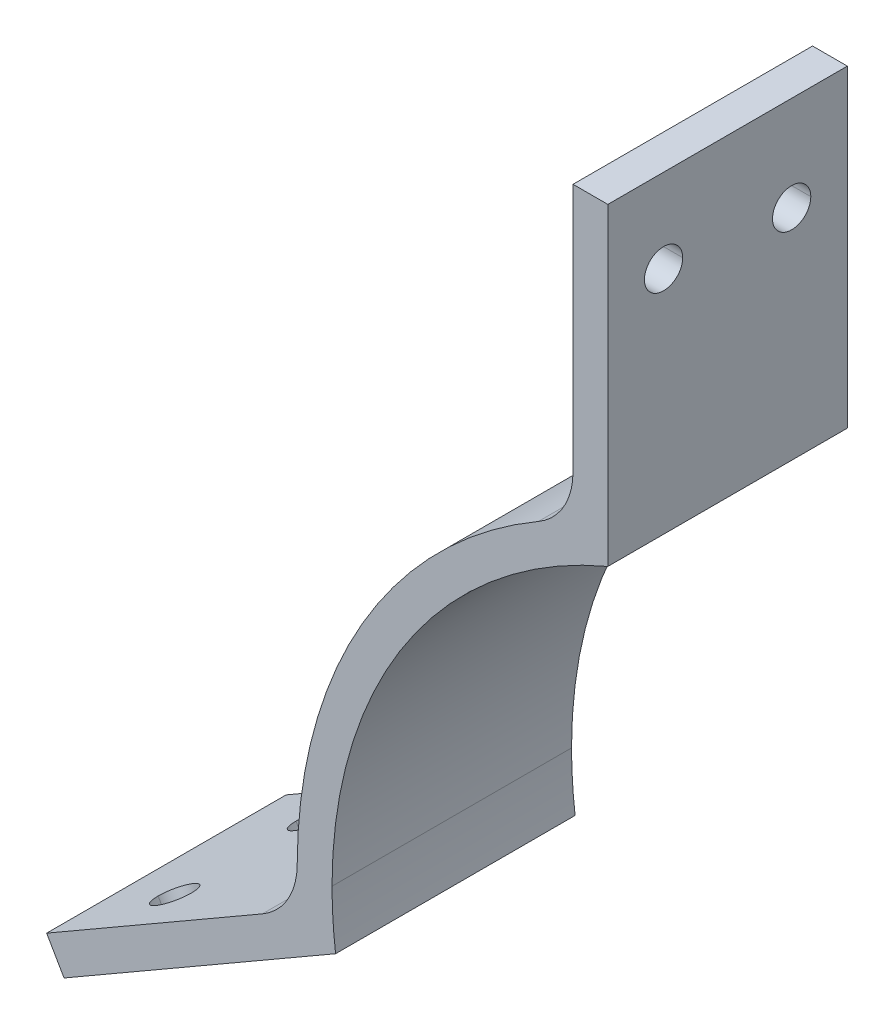
ISO-10303-21;
HEADER;
FILE_DESCRIPTION(('STEP AP214'),'2;1');
FILE_NAME('part.step','',(''),(''),'','','');
FILE_SCHEMA(('AUTOMOTIVE_DESIGN { 1 0 10303 214 1 1 1 1 }'));
ENDSEC;
DATA;
#1=APPLICATION_CONTEXT('core data for automotive mechanical design processes');
#2=APPLICATION_PROTOCOL_DEFINITION('international standard','automotive_design',2000,#1);
#3=PRODUCT_CONTEXT('',#1,'mechanical');
#4=PRODUCT('Part','Part','',(#3));
#5=PRODUCT_RELATED_PRODUCT_CATEGORY('part','',(#4));
#6=PRODUCT_DEFINITION_FORMATION('','',#4);
#7=PRODUCT_DEFINITION_CONTEXT('part definition',#1,'design');
#8=PRODUCT_DEFINITION('design','',#6,#7);
#9=PRODUCT_DEFINITION_SHAPE('','',#8);
#10=(LENGTH_UNIT() NAMED_UNIT(*) SI_UNIT(.MILLI.,.METRE.));
#11=(NAMED_UNIT(*) PLANE_ANGLE_UNIT() SI_UNIT($,.RADIAN.));
#12=(NAMED_UNIT(*) SI_UNIT($,.STERADIAN.) SOLID_ANGLE_UNIT());
#13=UNCERTAINTY_MEASURE_WITH_UNIT(LENGTH_MEASURE(1.E-05),#10,'distance_accuracy_value','');
#14=(GEOMETRIC_REPRESENTATION_CONTEXT(3) GLOBAL_UNCERTAINTY_ASSIGNED_CONTEXT((#13)) GLOBAL_UNIT_ASSIGNED_CONTEXT((#10,
#11,#12)) REPRESENTATION_CONTEXT('',''));
#15=CARTESIAN_POINT('',(0.,0.,0.));
#16=DIRECTION('',(0.,0.,1.));
#17=DIRECTION('',(1.,0.,0.));
#18=AXIS2_PLACEMENT_3D('',#15,#16,#17);
#19=CARTESIAN_POINT('',(-30.,91.005208591123,8.));
#20=DIRECTION('',(-1.,0.,0.));
#21=DIRECTION('',(0.,0.,1.));
#22=AXIS2_PLACEMENT_3D('',#19,#20,#21);
#23=CYLINDRICAL_SURFACE('',#22,2.75);
#24=CARTESIAN_POINT('',(-25.,91.005208591123,8.));
#25=DIRECTION('',(-1.,0.,0.));
#26=DIRECTION('',(0.,-1.,0.));
#27=AXIS2_PLACEMENT_3D('',#24,#25,#26);
#28=CIRCLE('',#27,2.75);
#29=CARTESIAN_POINT('',(-25.,91.005208591123,5.25));
#30=VERTEX_POINT('',#29);
#31=CARTESIAN_POINT('',(-25.,91.005208591123,10.75));
#32=VERTEX_POINT('',#31);
#33=EDGE_CURVE('E41',#30,#32,#28,.T.);
#34=ORIENTED_EDGE('',*,*,#33,.F.);
#35=DIRECTION('',(-1.,0.,0.));
#36=VECTOR('',#35,1.);
#37=CARTESIAN_POINT('',(-30.,91.005208591123,5.25));
#38=LINE('',#37,#36);
#39=CARTESIAN_POINT('',(-30.,91.005208591123,5.25));
#40=VERTEX_POINT('',#39);
#41=EDGE_CURVE('E11',#30,#40,#38,.T.);
#42=ORIENTED_EDGE('',*,*,#41,.T.);
#43=CARTESIAN_POINT('',(-30.,91.005208591123,8.));
#44=DIRECTION('',(-1.,0.,0.));
#45=DIRECTION('',(0.,0.,1.));
#46=AXIS2_PLACEMENT_3D('',#43,#44,#45);
#47=CIRCLE('',#46,2.75);
#48=CARTESIAN_POINT('',(-30.,91.005208591123,10.75));
#49=VERTEX_POINT('',#48);
#50=EDGE_CURVE('E27',#40,#49,#47,.T.);
#51=ORIENTED_EDGE('',*,*,#50,.T.);
#52=DIRECTION('',(-1.,0.,0.));
#53=VECTOR('',#52,1.);
#54=CARTESIAN_POINT('',(-30.,91.005208591123,10.75));
#55=LINE('',#54,#53);
#56=EDGE_CURVE('E244',#32,#49,#55,.T.);
#57=ORIENTED_EDGE('',*,*,#56,.F.);
#58=EDGE_LOOP('',(#34,#42,#51,#57));
#59=FACE_BOUND('',#58,.T.);
#60=ADVANCED_FACE('F16',(#59),#23,.F.);
#61=CARTESIAN_POINT('',(-30.,92.615,26.4));
#62=DIRECTION('',(-1.,0.,0.));
#63=DIRECTION('',(0.,0.,1.));
#64=AXIS2_PLACEMENT_3D('',#61,#62,#63);
#65=CYLINDRICAL_SURFACE('',#64,2.75);
#66=CARTESIAN_POINT('',(-25.,92.615,26.4));
#67=DIRECTION('',(-1.,0.,0.));
#68=DIRECTION('',(0.,-1.,0.));
#69=AXIS2_PLACEMENT_3D('',#66,#67,#68);
#70=CIRCLE('',#69,2.75);
#71=CARTESIAN_POINT('',(-25.,92.615,23.65));
#72=VERTEX_POINT('',#71);
#73=CARTESIAN_POINT('',(-25.,92.615,29.15));
#74=VERTEX_POINT('',#73);
#75=EDGE_CURVE('E235',#72,#74,#70,.T.);
#76=ORIENTED_EDGE('',*,*,#75,.F.);
#77=DIRECTION('',(-1.,0.,0.));
#78=VECTOR('',#77,1.);
#79=CARTESIAN_POINT('',(-30.,92.615,23.65));
#80=LINE('',#79,#78);
#81=CARTESIAN_POINT('',(-30.,92.615,23.65));
#82=VERTEX_POINT('',#81);
#83=EDGE_CURVE('E229',#72,#82,#80,.T.);
#84=ORIENTED_EDGE('',*,*,#83,.T.);
#85=CARTESIAN_POINT('',(-30.,92.615,26.4));
#86=DIRECTION('',(-1.,0.,0.));
#87=DIRECTION('',(0.,0.,1.));
#88=AXIS2_PLACEMENT_3D('',#85,#86,#87);
#89=CIRCLE('',#88,2.75);
#90=CARTESIAN_POINT('',(-30.,92.615,29.15));
#91=VERTEX_POINT('',#90);
#92=EDGE_CURVE('E222',#82,#91,#89,.T.);
#93=ORIENTED_EDGE('',*,*,#92,.T.);
#94=DIRECTION('',(-1.,0.,0.));
#95=VECTOR('',#94,1.);
#96=CARTESIAN_POINT('',(-30.,92.615,29.15));
#97=LINE('',#96,#95);
#98=EDGE_CURVE('E242',#74,#91,#97,.T.);
#99=ORIENTED_EDGE('',*,*,#98,.F.);
#100=EDGE_LOOP('',(#76,#84,#93,#99));
#101=FACE_BOUND('',#100,.T.);
#102=ADVANCED_FACE('F233',(#101),#65,.F.);
#103=CARTESIAN_POINT('',(-95.2069427714958,-20.3267378864669,26.4));
#104=DIRECTION('',(-0.5,0.866025403784439,0.));
#105=DIRECTION('',(-0.866025403784439,-0.5,0.));
#106=AXIS2_PLACEMENT_3D('',#103,#104,#105);
#107=CYLINDRICAL_SURFACE('',#106,2.75);
#108=CARTESIAN_POINT('',(-92.7069427714957,-24.6568649053891,26.4));
#109=DIRECTION('',(0.5,-0.866025403784438,0.));
#110=DIRECTION('',(0.866025403784438,0.5,0.));
#111=AXIS2_PLACEMENT_3D('',#108,#109,#110);
#112=CIRCLE('',#111,2.75);
#113=CARTESIAN_POINT('',(-95.0885126319029,-26.0318649053891,26.4));
#114=VERTEX_POINT('',#113);
#115=CARTESIAN_POINT('',(-90.3253729110885,-23.2818649053891,26.4));
#116=VERTEX_POINT('',#115);
#117=EDGE_CURVE('E230',#114,#116,#112,.T.);
#118=ORIENTED_EDGE('',*,*,#117,.T.);
#119=DIRECTION('',(-0.5,0.866025403784439,0.));
#120=VECTOR('',#119,1.);
#121=CARTESIAN_POINT('',(-92.8253729110886,-18.9517378864669,26.4));
#122=LINE('',#121,#120);
#123=CARTESIAN_POINT('',(-92.8253729110886,-18.9517378864669,26.4));
#124=VERTEX_POINT('',#123);
#125=EDGE_CURVE('E273',#116,#124,#122,.T.);
#126=ORIENTED_EDGE('',*,*,#125,.T.);
#127=CARTESIAN_POINT('',(-95.2069427714958,-20.3267378864669,26.4));
#128=DIRECTION('',(-0.5,0.866025403784438,0.));
#129=DIRECTION('',(-0.866025403784438,-0.5,0.));
#130=AXIS2_PLACEMENT_3D('',#127,#128,#129);
#131=CIRCLE('',#130,2.75);
#132=CARTESIAN_POINT('',(-97.588512631903,-21.7017378864669,26.4));
#133=VERTEX_POINT('',#132);
#134=EDGE_CURVE('E269',#124,#133,#131,.T.);
#135=ORIENTED_EDGE('',*,*,#134,.T.);
#136=DIRECTION('',(-0.5,0.866025403784439,0.));
#137=VECTOR('',#136,1.);
#138=CARTESIAN_POINT('',(-97.588512631903,-21.7017378864669,26.4));
#139=LINE('',#138,#137);
#140=EDGE_CURVE('E320',#114,#133,#139,.T.);
#141=ORIENTED_EDGE('',*,*,#140,.F.);
#142=EDGE_LOOP('',(#118,#126,#135,#141));
#143=FACE_BOUND('',#142,.T.);
#144=ADVANCED_FACE('F440',(#143),#107,.F.);
#145=CARTESIAN_POINT('',(-93.8128225166144,-19.5218421820284,8.));
#146=DIRECTION('',(-0.5,0.866025403784438,0.));
#147=DIRECTION('',(-0.866025403784438,-0.5,0.));
#148=AXIS2_PLACEMENT_3D('',#145,#146,#147);
#149=CYLINDRICAL_SURFACE('',#148,2.75);
#150=CARTESIAN_POINT('',(-91.3128225166144,-23.8519692009506,8.));
#151=DIRECTION('',(0.5,-0.866025403784438,0.));
#152=DIRECTION('',(0.866025403784438,0.5,0.));
#153=AXIS2_PLACEMENT_3D('',#150,#151,#152);
#154=CIRCLE('',#153,2.75);
#155=CARTESIAN_POINT('',(-93.6943923770216,-25.2269692009506,8.));
#156=VERTEX_POINT('',#155);
#157=CARTESIAN_POINT('',(-88.9312526562072,-22.4769692009506,8.));
#158=VERTEX_POINT('',#157);
#159=EDGE_CURVE('E274',#156,#158,#154,.T.);
#160=ORIENTED_EDGE('',*,*,#159,.T.);
#161=DIRECTION('',(-0.5,0.866025403784439,0.));
#162=VECTOR('',#161,1.);
#163=CARTESIAN_POINT('',(-91.4312526562072,-18.1468421820284,8.));
#164=LINE('',#163,#162);
#165=CARTESIAN_POINT('',(-91.4312526562072,-18.1468421820284,8.));
#166=VERTEX_POINT('',#165);
#167=EDGE_CURVE('E283',#158,#166,#164,.T.);
#168=ORIENTED_EDGE('',*,*,#167,.T.);
#169=CARTESIAN_POINT('',(-93.8128225166144,-19.5218421820284,8.));
#170=DIRECTION('',(-0.5,0.866025403784438,0.));
#171=DIRECTION('',(-0.866025403784438,-0.5,0.));
#172=AXIS2_PLACEMENT_3D('',#169,#170,#171);
#173=CIRCLE('',#172,2.75);
#174=CARTESIAN_POINT('',(-96.1943923770216,-20.8968421820284,8.));
#175=VERTEX_POINT('',#174);
#176=EDGE_CURVE('E290',#166,#175,#173,.T.);
#177=ORIENTED_EDGE('',*,*,#176,.T.);
#178=DIRECTION('',(-0.5,0.866025403784439,0.));
#179=VECTOR('',#178,1.);
#180=CARTESIAN_POINT('',(-96.1943923770216,-20.8968421820284,8.));
#181=LINE('',#180,#179);
#182=EDGE_CURVE('E339',#156,#175,#181,.T.);
#183=ORIENTED_EDGE('',*,*,#182,.F.);
#184=EDGE_LOOP('',(#160,#168,#177,#183));
#185=FACE_BOUND('',#184,.T.);
#186=ADVANCED_FACE('F691',(#185),#149,.F.);
#187=CARTESIAN_POINT('',(0.,0.,34.4));
#188=DIRECTION('',(0.,0.,-1.));
#189=DIRECTION('',(-1.,0.,0.));
#190=AXIS2_PLACEMENT_3D('',#187,#188,#189);
#191=CYLINDRICAL_SURFACE('',#190,64.615);
#192=CARTESIAN_POINT('',(0.,0.,34.4));
#193=DIRECTION('',(0.,0.,1.));
#194=DIRECTION('',(1.,0.,0.));
#195=AXIS2_PLACEMENT_3D('',#192,#193,#194);
#196=CIRCLE('',#195,64.615);
#197=CARTESIAN_POINT('',(-25.,59.5827007192524,34.4));
#198=VERTEX_POINT('',#197);
#199=CARTESIAN_POINT('',(-64.615,0.,34.4));
#200=VERTEX_POINT('',#199);
#201=EDGE_CURVE('E328',#198,#200,#196,.T.);
#202=ORIENTED_EDGE('',*,*,#201,.T.);
#203=DIRECTION('',(0.,0.,-1.));
#204=VECTOR('',#203,1.);
#205=CARTESIAN_POINT('',(-64.615,0.,34.4));
#206=LINE('',#205,#204);
#207=CARTESIAN_POINT('',(-64.615,0.,0.));
#208=VERTEX_POINT('',#207);
#209=EDGE_CURVE('E313',#200,#208,#206,.T.);
#210=ORIENTED_EDGE('',*,*,#209,.T.);
#211=CARTESIAN_POINT('',(0.,0.,0.));
#212=DIRECTION('',(0.,0.,1.));
#213=DIRECTION('',(1.,0.,0.));
#214=AXIS2_PLACEMENT_3D('',#211,#212,#213);
#215=CIRCLE('',#214,64.615);
#216=CARTESIAN_POINT('',(-25.,59.5827007192524,0.));
#217=VERTEX_POINT('',#216);
#218=EDGE_CURVE('E291',#217,#208,#215,.T.);
#219=ORIENTED_EDGE('',*,*,#218,.F.);
#220=DIRECTION('',(0.,0.,-1.));
#221=VECTOR('',#220,1.);
#222=CARTESIAN_POINT('',(-25.,59.5827007192524,34.4));
#223=LINE('',#222,#221);
#224=EDGE_CURVE('E275',#198,#217,#223,.T.);
#225=ORIENTED_EDGE('',*,*,#224,.F.);
#226=EDGE_LOOP('',(#202,#210,#219,#225));
#227=FACE_BOUND('',#226,.T.);
#228=ADVANCED_FACE('F448',(#227),#191,.F.);
#229=CARTESIAN_POINT('',(0.,0.,34.4));
#230=DIRECTION('',(0.,0.,-1.));
#231=DIRECTION('',(-1.,0.,0.));
#232=AXIS2_PLACEMENT_3D('',#229,#230,#231);
#233=CYLINDRICAL_SURFACE('',#232,64.615);
#234=ORIENTED_EDGE('',*,*,#209,.F.);
#235=CARTESIAN_POINT('',(0.,0.,34.4));
#236=DIRECTION('',(0.,0.,1.));
#237=DIRECTION('',(1.,0.,0.));
#238=AXIS2_PLACEMENT_3D('',#235,#236,#237);
#239=CIRCLE('',#238,64.615);
#240=CARTESIAN_POINT('',(-64.1001324489579,-8.14071526501525,34.4));
#241=VERTEX_POINT('',#240);
#242=EDGE_CURVE('E309',#200,#241,#239,.T.);
#243=ORIENTED_EDGE('',*,*,#242,.T.);
#244=DIRECTION('',(0.,0.,-1.));
#245=VECTOR('',#244,1.);
#246=CARTESIAN_POINT('',(-64.1001324489579,-8.14071526501525,34.4));
#247=LINE('',#246,#245);
#248=CARTESIAN_POINT('',(-64.1001324489579,-8.14071526501525,0.));
#249=VERTEX_POINT('',#248);
#250=EDGE_CURVE('E314',#241,#249,#247,.T.);
#251=ORIENTED_EDGE('',*,*,#250,.T.);
#252=CARTESIAN_POINT('',(0.,0.,0.));
#253=DIRECTION('',(0.,0.,1.));
#254=DIRECTION('',(1.,0.,0.));
#255=AXIS2_PLACEMENT_3D('',#252,#253,#254);
#256=CIRCLE('',#255,64.615);
#257=EDGE_CURVE('E257',#208,#249,#256,.T.);
#258=ORIENTED_EDGE('',*,*,#257,.F.);
#259=EDGE_LOOP('',(#234,#243,#251,#258));
#260=FACE_BOUND('',#259,.T.);
#261=ADVANCED_FACE('F444',(#260),#233,.F.);
#262=CARTESIAN_POINT('',(-25.,0.,34.4));
#263=DIRECTION('',(-1.,0.,0.));
#264=DIRECTION('',(0.,0.,1.));
#265=AXIS2_PLACEMENT_3D('',#262,#263,#264);
#266=PLANE('',#265);
#267=DIRECTION('',(0.,1.,0.));
#268=VECTOR('',#267,1.);
#269=CARTESIAN_POINT('',(-25.,0.,0.));
#270=LINE('',#269,#268);
#271=CARTESIAN_POINT('',(-25.,104.615,0.));
#272=VERTEX_POINT('',#271);
#273=EDGE_CURVE('E279',#217,#272,#270,.T.);
#274=ORIENTED_EDGE('',*,*,#273,.T.);
#275=DIRECTION('',(0.,0.,-1.));
#276=VECTOR('',#275,1.);
#277=CARTESIAN_POINT('',(-25.,104.615,34.4));
#278=LINE('',#277,#276);
#279=CARTESIAN_POINT('',(-25.,104.615,34.4));
#280=VERTEX_POINT('',#279);
#281=EDGE_CURVE('E366',#280,#272,#278,.T.);
#282=ORIENTED_EDGE('',*,*,#281,.F.);
#283=DIRECTION('',(0.,1.,0.));
#284=VECTOR('',#283,1.);
#285=CARTESIAN_POINT('',(-25.,0.,34.4));
#286=LINE('',#285,#284);
#287=EDGE_CURVE('E304',#198,#280,#286,.T.);
#288=ORIENTED_EDGE('',*,*,#287,.F.);
#289=ORIENTED_EDGE('',*,*,#224,.T.);
#290=EDGE_LOOP('',(#274,#282,#288,#289));
#291=FACE_BOUND('',#290,.T.);
#292=CARTESIAN_POINT('',(-25.,91.005208591123,8.));
#293=DIRECTION('',(-1.,0.,0.));
#294=DIRECTION('',(0.,-1.,0.));
#295=AXIS2_PLACEMENT_3D('',#292,#293,#294);
#296=CIRCLE('',#295,2.75);
#297=EDGE_CURVE('E280',#32,#30,#296,.T.);
#298=ORIENTED_EDGE('',*,*,#297,.T.);
#299=ORIENTED_EDGE('',*,*,#33,.T.);
#300=EDGE_LOOP('',(#298,#299));
#301=FACE_BOUND('',#300,.T.);
#302=CARTESIAN_POINT('',(-25.,92.615,26.4));
#303=DIRECTION('',(-1.,0.,0.));
#304=DIRECTION('',(0.,-1.,0.));
#305=AXIS2_PLACEMENT_3D('',#302,#303,#304);
#306=CIRCLE('',#305,2.75);
#307=EDGE_CURVE('E259',#74,#72,#306,.T.);
#308=ORIENTED_EDGE('',*,*,#307,.T.);
#309=ORIENTED_EDGE('',*,*,#75,.T.);
#310=EDGE_LOOP('',(#308,#309));
#311=FACE_BOUND('',#310,.T.);
#312=ADVANCED_FACE('F447',(#291,#301,#311),#266,.F.);
#313=CARTESIAN_POINT('',(-8.71094862908707E-13,104.615,34.4));
#314=DIRECTION('',(0.,-1.,0.));
#315=DIRECTION('',(0.,0.,-1.));
#316=AXIS2_PLACEMENT_3D('',#313,#314,#315);
#317=PLANE('',#316);
#318=DIRECTION('',(-1.,0.,0.));
#319=VECTOR('',#318,1.);
#320=CARTESIAN_POINT('',(-8.71094862908707E-13,104.615,0.));
#321=LINE('',#320,#319);
#322=CARTESIAN_POINT('',(-30.,104.615,0.));
#323=VERTEX_POINT('',#322);
#324=EDGE_CURVE('E369',#272,#323,#321,.T.);
#325=ORIENTED_EDGE('',*,*,#324,.T.);
#326=DIRECTION('',(0.,0.,-1.));
#327=VECTOR('',#326,1.);
#328=CARTESIAN_POINT('',(-30.,104.615,34.4));
#329=LINE('',#328,#327);
#330=CARTESIAN_POINT('',(-30.,104.615,34.4));
#331=VERTEX_POINT('',#330);
#332=EDGE_CURVE('E300',#331,#323,#329,.T.);
#333=ORIENTED_EDGE('',*,*,#332,.F.);
#334=DIRECTION('',(-1.,0.,0.));
#335=VECTOR('',#334,1.);
#336=CARTESIAN_POINT('',(-8.71094862908707E-13,104.615,34.4));
#337=LINE('',#336,#335);
#338=EDGE_CURVE('E301',#280,#331,#337,.T.);
#339=ORIENTED_EDGE('',*,*,#338,.F.);
#340=ORIENTED_EDGE('',*,*,#281,.T.);
#341=EDGE_LOOP('',(#325,#333,#339,#340));
#342=FACE_BOUND('',#341,.T.);
#343=ADVANCED_FACE('F430',(#342),#317,.F.);
#344=CARTESIAN_POINT('',(-30.,0.,34.4));
#345=DIRECTION('',(1.,0.,0.));
#346=DIRECTION('',(0.,1.,0.));
#347=AXIS2_PLACEMENT_3D('',#344,#345,#346);
#348=PLANE('',#347);
#349=DIRECTION('',(0.,-1.,0.));
#350=VECTOR('',#349,1.);
#351=CARTESIAN_POINT('',(-30.,0.,0.));
#352=LINE('',#351,#350);
#353=CARTESIAN_POINT('',(-30.,68.8371137178194,0.));
#354=VERTEX_POINT('',#353);
#355=EDGE_CURVE('E299',#323,#354,#352,.T.);
#356=ORIENTED_EDGE('',*,*,#355,.T.);
#357=DIRECTION('',(0.,0.,1.));
#358=VECTOR('',#357,1.);
#359=CARTESIAN_POINT('',(-30.,68.8371137178194,34.4));
#360=LINE('',#359,#358);
#361=CARTESIAN_POINT('',(-30.,68.8371137178194,34.4));
#362=VERTEX_POINT('',#361);
#363=EDGE_CURVE('E295',#354,#362,#360,.T.);
#364=ORIENTED_EDGE('',*,*,#363,.T.);
#365=DIRECTION('',(0.,-1.,0.));
#366=VECTOR('',#365,1.);
#367=CARTESIAN_POINT('',(-30.,0.,34.4));
#368=LINE('',#367,#366);
#369=EDGE_CURVE('E305',#331,#362,#368,.T.);
#370=ORIENTED_EDGE('',*,*,#369,.F.);
#371=ORIENTED_EDGE('',*,*,#332,.T.);
#372=EDGE_LOOP('',(#356,#364,#370,#371));
#373=FACE_BOUND('',#372,.T.);
#374=CARTESIAN_POINT('',(-30.,91.005208591123,8.));
#375=DIRECTION('',(-1.,0.,0.));
#376=DIRECTION('',(0.,0.,1.));
#377=AXIS2_PLACEMENT_3D('',#374,#375,#376);
#378=CIRCLE('',#377,2.75);
#379=EDGE_CURVE('E253',#49,#40,#378,.T.);
#380=ORIENTED_EDGE('',*,*,#379,.F.);
#381=ORIENTED_EDGE('',*,*,#50,.F.);
#382=EDGE_LOOP('',(#380,#381));
#383=FACE_BOUND('',#382,.T.);
#384=CARTESIAN_POINT('',(-30.,92.615,26.4));
#385=DIRECTION('',(-1.,0.,0.));
#386=DIRECTION('',(0.,0.,1.));
#387=AXIS2_PLACEMENT_3D('',#384,#385,#386);
#388=CIRCLE('',#387,2.75);
#389=EDGE_CURVE('E226',#91,#82,#388,.T.);
#390=ORIENTED_EDGE('',*,*,#389,.F.);
#391=ORIENTED_EDGE('',*,*,#92,.F.);
#392=EDGE_LOOP('',(#390,#391));
#393=FACE_BOUND('',#392,.T.);
#394=ADVANCED_FACE('F224',(#373,#383,#393),#348,.F.);
#395=CARTESIAN_POINT('',(0.,0.,34.4));
#396=DIRECTION('',(0.,0.,-1.));
#397=DIRECTION('',(-1.,0.,0.));
#398=AXIS2_PLACEMENT_3D('',#395,#396,#397);
#399=CYLINDRICAL_SURFACE('',#398,69.615);
#400=CARTESIAN_POINT('',(0.,0.,0.));
#401=DIRECTION('',(0.,0.,1.));
#402=DIRECTION('',(1.,0.,0.));
#403=AXIS2_PLACEMENT_3D('',#400,#401,#402);
#404=CIRCLE('',#403,69.615);
#405=CARTESIAN_POINT('',(-34.9758211392325,60.1908644283866,0.));
#406=VERTEX_POINT('',#405);
#407=CARTESIAN_POINT('',(-69.6147282403442,0.194517410602863,0.));
#408=VERTEX_POINT('',#407);
#409=EDGE_CURVE('E360',#406,#408,#404,.T.);
#410=ORIENTED_EDGE('',*,*,#409,.T.);
#411=DIRECTION('',(0.,0.,1.));
#412=VECTOR('',#411,1.);
#413=CARTESIAN_POINT('',(-69.6147282403442,0.194517410602863,34.4));
#414=LINE('',#413,#412);
#415=CARTESIAN_POINT('',(-69.6147282403442,0.194517410602863,34.4));
#416=VERTEX_POINT('',#415);
#417=EDGE_CURVE('E308',#408,#416,#414,.T.);
#418=ORIENTED_EDGE('',*,*,#417,.T.);
#419=CARTESIAN_POINT('',(0.,0.,34.4));
#420=DIRECTION('',(0.,0.,1.));
#421=DIRECTION('',(1.,0.,0.));
#422=AXIS2_PLACEMENT_3D('',#419,#420,#421);
#423=CIRCLE('',#422,69.615);
#424=CARTESIAN_POINT('',(-34.9758211392325,60.1908644283866,34.4));
#425=VERTEX_POINT('',#424);
#426=EDGE_CURVE('E327',#425,#416,#423,.T.);
#427=ORIENTED_EDGE('',*,*,#426,.F.);
#428=DIRECTION('',(0.,0.,-1.));
#429=VECTOR('',#428,1.);
#430=CARTESIAN_POINT('',(-34.9758211392325,60.1908644283866,34.4));
#431=LINE('',#430,#429);
#432=EDGE_CURVE('E167',#425,#406,#431,.T.);
#433=ORIENTED_EDGE('',*,*,#432,.T.);
#434=EDGE_LOOP('',(#410,#418,#427,#433));
#435=FACE_BOUND('',#434,.T.);
#436=ADVANCED_FACE('F420',(#435),#399,.T.);
#437=CARTESIAN_POINT('',(-15.,25.9807621135331,34.4));
#438=DIRECTION('',(-0.5,0.866025403784439,0.));
#439=DIRECTION('',(0.,0.,1.));
#440=AXIS2_PLACEMENT_3D('',#437,#438,#439);
#441=PLANE('',#440);
#442=DIRECTION('',(0.866025403784439,0.5,0.));
#443=VECTOR('',#442,1.);
#444=CARTESIAN_POINT('',(-15.,25.9807621135331,34.4));
#445=LINE('',#444,#443);
#446=CARTESIAN_POINT('',(-105.599247616909,-26.3267378864669,34.4));
#447=VERTEX_POINT('',#446);
#448=CARTESIAN_POINT('',(-74.6146892028299,-8.43779474537657,34.4));
#449=VERTEX_POINT('',#448);
#450=EDGE_CURVE('E262',#447,#449,#445,.T.);
#451=ORIENTED_EDGE('',*,*,#450,.T.);
#452=DIRECTION('',(0.,0.,-1.));
#453=VECTOR('',#452,1.);
#454=CARTESIAN_POINT('',(-74.6146892028299,-8.43779474537657,34.4));
#455=LINE('',#454,#453);
#456=CARTESIAN_POINT('',(-74.6146892028299,-8.43779474537657,0.));
#457=VERTEX_POINT('',#456);
#458=EDGE_CURVE('E177',#449,#457,#455,.T.);
#459=ORIENTED_EDGE('',*,*,#458,.T.);
#460=DIRECTION('',(0.866025403784439,0.5,0.));
#461=VECTOR('',#460,1.);
#462=CARTESIAN_POINT('',(-15.,25.9807621135331,0.));
#463=LINE('',#462,#461);
#464=CARTESIAN_POINT('',(-105.599247616909,-26.3267378864669,0.));
#465=VERTEX_POINT('',#464);
#466=EDGE_CURVE('E187',#465,#457,#463,.T.);
#467=ORIENTED_EDGE('',*,*,#466,.F.);
#468=DIRECTION('',(0.,0.,-1.));
#469=VECTOR('',#468,1.);
#470=CARTESIAN_POINT('',(-105.599247616909,-26.3267378864669,34.4));
#471=LINE('',#470,#469);
#472=EDGE_CURVE('E61',#447,#465,#471,.T.);
#473=ORIENTED_EDGE('',*,*,#472,.F.);
#474=EDGE_LOOP('',(#451,#459,#467,#473));
#475=FACE_BOUND('',#474,.T.);
#476=CARTESIAN_POINT('',(-95.2069427714958,-20.3267378864669,26.4));
#477=DIRECTION('',(-0.5,0.866025403784438,0.));
#478=DIRECTION('',(-0.866025403784438,-0.5,0.));
#479=AXIS2_PLACEMENT_3D('',#476,#477,#478);
#480=CIRCLE('',#479,2.75);
#481=EDGE_CURVE('E251',#133,#124,#480,.T.);
#482=ORIENTED_EDGE('',*,*,#481,.F.);
#483=ORIENTED_EDGE('',*,*,#134,.F.);
#484=EDGE_LOOP('',(#482,#483));
#485=FACE_BOUND('',#484,.T.);
#486=CARTESIAN_POINT('',(-93.8128225166144,-19.5218421820284,8.));
#487=DIRECTION('',(-0.5,0.866025403784438,0.));
#488=DIRECTION('',(-0.866025403784438,-0.5,0.));
#489=AXIS2_PLACEMENT_3D('',#486,#487,#488);
#490=CIRCLE('',#489,2.75);
#491=EDGE_CURVE('E319',#175,#166,#490,.T.);
#492=ORIENTED_EDGE('',*,*,#491,.F.);
#493=ORIENTED_EDGE('',*,*,#176,.F.);
#494=EDGE_LOOP('',(#492,#493));
#495=FACE_BOUND('',#494,.T.);
#496=ADVANCED_FACE('F422',(#475,#485,#495),#441,.T.);
#497=CARTESIAN_POINT('',(-90.5992476169093,-52.3075,34.4));
#498=DIRECTION('',(-0.86602540378444,-0.5,0.));
#499=DIRECTION('',(-0.5,0.86602540378444,0.));
#500=AXIS2_PLACEMENT_3D('',#497,#498,#499);
#501=PLANE('',#500);
#502=DIRECTION('',(-0.5,0.86602540378444,0.));
#503=VECTOR('',#502,1.);
#504=CARTESIAN_POINT('',(-90.5992476169093,-52.3075,0.));
#505=LINE('',#504,#503);
#506=CARTESIAN_POINT('',(-103.099247616909,-30.6568649053891,0.));
#507=VERTEX_POINT('',#506);
#508=EDGE_CURVE('E77',#507,#465,#505,.T.);
#509=ORIENTED_EDGE('',*,*,#508,.F.);
#510=DIRECTION('',(0.,0.,-1.));
#511=VECTOR('',#510,1.);
#512=CARTESIAN_POINT('',(-103.099247616909,-30.6568649053891,34.4));
#513=LINE('',#512,#511);
#514=CARTESIAN_POINT('',(-103.099247616909,-30.6568649053891,34.4));
#515=VERTEX_POINT('',#514);
#516=EDGE_CURVE('E470',#515,#507,#513,.T.);
#517=ORIENTED_EDGE('',*,*,#516,.F.);
#518=DIRECTION('',(-0.5,0.86602540378444,0.));
#519=VECTOR('',#518,1.);
#520=CARTESIAN_POINT('',(-90.5992476169093,-52.3075,34.4));
#521=LINE('',#520,#519);
#522=EDGE_CURVE('E265',#515,#447,#521,.T.);
#523=ORIENTED_EDGE('',*,*,#522,.T.);
#524=ORIENTED_EDGE('',*,*,#472,.T.);
#525=EDGE_LOOP('',(#509,#517,#523,#524));
#526=FACE_BOUND('',#525,.T.);
#527=ADVANCED_FACE('F429',(#526),#501,.T.);
#528=CARTESIAN_POINT('',(-12.5,21.650635094611,34.4));
#529=DIRECTION('',(0.5,-0.866025403784438,0.));
#530=DIRECTION('',(0.,0.,-1.));
#531=AXIS2_PLACEMENT_3D('',#528,#529,#530);
#532=PLANE('',#531);
#533=DIRECTION('',(-0.866025403784438,-0.5,0.));
#534=VECTOR('',#533,1.);
#535=CARTESIAN_POINT('',(-12.5,21.650635094611,0.));
#536=LINE('',#535,#534);
#537=EDGE_CURVE('E345',#249,#507,#536,.T.);
#538=ORIENTED_EDGE('',*,*,#537,.F.);
#539=ORIENTED_EDGE('',*,*,#250,.F.);
#540=DIRECTION('',(-0.866025403784438,-0.5,0.));
#541=VECTOR('',#540,1.);
#542=CARTESIAN_POINT('',(-12.5,21.650635094611,34.4));
#543=LINE('',#542,#541);
#544=EDGE_CURVE('E20',#241,#515,#543,.T.);
#545=ORIENTED_EDGE('',*,*,#544,.T.);
#546=ORIENTED_EDGE('',*,*,#516,.T.);
#547=EDGE_LOOP('',(#538,#539,#545,#546));
#548=FACE_BOUND('',#547,.T.);
#549=ORIENTED_EDGE('',*,*,#117,.F.);
#550=CARTESIAN_POINT('',(-92.7069427714957,-24.6568649053891,26.4));
#551=DIRECTION('',(0.5,-0.866025403784438,0.));
#552=DIRECTION('',(0.866025403784438,0.5,0.));
#553=AXIS2_PLACEMENT_3D('',#550,#551,#552);
#554=CIRCLE('',#553,2.75);
#555=EDGE_CURVE('E315',#116,#114,#554,.T.);
#556=ORIENTED_EDGE('',*,*,#555,.F.);
#557=EDGE_LOOP('',(#549,#556));
#558=FACE_BOUND('',#557,.T.);
#559=ORIENTED_EDGE('',*,*,#159,.F.);
#560=CARTESIAN_POINT('',(-91.3128225166144,-23.8519692009506,8.));
#561=DIRECTION('',(0.5,-0.866025403784438,0.));
#562=DIRECTION('',(0.866025403784438,0.5,0.));
#563=AXIS2_PLACEMENT_3D('',#560,#561,#562);
#564=CIRCLE('',#563,2.75);
#565=EDGE_CURVE('E342',#158,#156,#564,.T.);
#566=ORIENTED_EDGE('',*,*,#565,.F.);
#567=EDGE_LOOP('',(#559,#566));
#568=FACE_BOUND('',#567,.T.);
#569=ADVANCED_FACE('F452',(#548,#558,#568),#532,.T.);
#570=CARTESIAN_POINT('',(0.,0.,34.4));
#571=DIRECTION('',(0.,0.,1.));
#572=DIRECTION('',(1.,0.,0.));
#573=AXIS2_PLACEMENT_3D('',#570,#571,#572);
#574=PLANE('',#573);
#575=ORIENTED_EDGE('',*,*,#201,.F.);
#576=ORIENTED_EDGE('',*,*,#287,.T.);
#577=ORIENTED_EDGE('',*,*,#338,.T.);
#578=ORIENTED_EDGE('',*,*,#369,.T.);
#579=CARTESIAN_POINT('',(-40.,68.8371137178194,34.4));
#580=DIRECTION('',(0.,0.,-1.));
#581=DIRECTION('',(1.,0.,0.));
#582=AXIS2_PLACEMENT_3D('',#579,#580,#581);
#583=CIRCLE('',#582,10.);
#584=EDGE_CURVE('E323',#362,#425,#583,.T.);
#585=ORIENTED_EDGE('',*,*,#584,.T.);
#586=ORIENTED_EDGE('',*,*,#426,.T.);
#587=CARTESIAN_POINT('',(-79.6146892028299,0.222459292467815,34.4));
#588=DIRECTION('',(0.,0.,-1.));
#589=DIRECTION('',(1.,0.,0.));
#590=AXIS2_PLACEMENT_3D('',#587,#588,#589);
#591=CIRCLE('',#590,10.);
#592=EDGE_CURVE('E294',#416,#449,#591,.T.);
#593=ORIENTED_EDGE('',*,*,#592,.T.);
#594=ORIENTED_EDGE('',*,*,#450,.F.);
#595=ORIENTED_EDGE('',*,*,#522,.F.);
#596=ORIENTED_EDGE('',*,*,#544,.F.);
#597=ORIENTED_EDGE('',*,*,#242,.F.);
#598=EDGE_LOOP('',(#575,#576,#577,#578,#585,#586,#593,#594,#595,#596,#597));
#599=FACE_BOUND('',#598,.T.);
#600=ADVANCED_FACE('F450',(#599),#574,.T.);
#601=CARTESIAN_POINT('',(0.,0.,0.));
#602=DIRECTION('',(0.,0.,1.));
#603=DIRECTION('',(1.,0.,0.));
#604=AXIS2_PLACEMENT_3D('',#601,#602,#603);
#605=PLANE('',#604);
#606=ORIENTED_EDGE('',*,*,#218,.T.);
#607=ORIENTED_EDGE('',*,*,#257,.T.);
#608=ORIENTED_EDGE('',*,*,#537,.T.);
#609=ORIENTED_EDGE('',*,*,#508,.T.);
#610=ORIENTED_EDGE('',*,*,#466,.T.);
#611=CARTESIAN_POINT('',(-79.6146892028299,0.222459292467815,0.));
#612=DIRECTION('',(0.,0.,1.));
#613=DIRECTION('',(1.,0.,0.));
#614=AXIS2_PLACEMENT_3D('',#611,#612,#613);
#615=CIRCLE('',#614,10.);
#616=EDGE_CURVE('E356',#457,#408,#615,.T.);
#617=ORIENTED_EDGE('',*,*,#616,.T.);
#618=ORIENTED_EDGE('',*,*,#409,.F.);
#619=CARTESIAN_POINT('',(-40.,68.8371137178194,0.));
#620=DIRECTION('',(0.,0.,1.));
#621=DIRECTION('',(1.,0.,0.));
#622=AXIS2_PLACEMENT_3D('',#619,#620,#621);
#623=CIRCLE('',#622,10.);
#624=EDGE_CURVE('E385',#406,#354,#623,.T.);
#625=ORIENTED_EDGE('',*,*,#624,.T.);
#626=ORIENTED_EDGE('',*,*,#355,.F.);
#627=ORIENTED_EDGE('',*,*,#324,.F.);
#628=ORIENTED_EDGE('',*,*,#273,.F.);
#629=EDGE_LOOP('',(#606,#607,#608,#609,#610,#617,#618,#625,#626,#627,#628));
#630=FACE_BOUND('',#629,.T.);
#631=ADVANCED_FACE('F417',(#630),#605,.F.);
#632=CARTESIAN_POINT('',(-79.6146892028299,0.222459292467815,34.4));
#633=DIRECTION('',(0.,0.,-1.));
#634=DIRECTION('',(-1.,0.,0.));
#635=AXIS2_PLACEMENT_3D('',#632,#633,#634);
#636=CYLINDRICAL_SURFACE('',#635,10.);
#637=ORIENTED_EDGE('',*,*,#592,.F.);
#638=ORIENTED_EDGE('',*,*,#417,.F.);
#639=ORIENTED_EDGE('',*,*,#616,.F.);
#640=ORIENTED_EDGE('',*,*,#458,.F.);
#641=EDGE_LOOP('',(#637,#638,#639,#640));
#642=FACE_BOUND('',#641,.T.);
#643=ADVANCED_FACE('F419',(#642),#636,.F.);
#644=CARTESIAN_POINT('',(-40.,68.8371137178194,34.4));
#645=DIRECTION('',(0.,0.,-1.));
#646=DIRECTION('',(-1.,0.,0.));
#647=AXIS2_PLACEMENT_3D('',#644,#645,#646);
#648=CYLINDRICAL_SURFACE('',#647,10.);
#649=ORIENTED_EDGE('',*,*,#584,.F.);
#650=ORIENTED_EDGE('',*,*,#363,.F.);
#651=ORIENTED_EDGE('',*,*,#624,.F.);
#652=ORIENTED_EDGE('',*,*,#432,.F.);
#653=EDGE_LOOP('',(#649,#650,#651,#652));
#654=FACE_BOUND('',#653,.T.);
#655=ADVANCED_FACE('F727',(#654),#648,.F.);
#656=CARTESIAN_POINT('',(-93.8128225166144,-19.5218421820284,8.));
#657=DIRECTION('',(-0.5,0.866025403784438,0.));
#658=DIRECTION('',(-0.866025403784438,-0.5,0.));
#659=AXIS2_PLACEMENT_3D('',#656,#657,#658);
#660=CYLINDRICAL_SURFACE('',#659,2.75);
#661=ORIENTED_EDGE('',*,*,#167,.F.);
#662=ORIENTED_EDGE('',*,*,#565,.T.);
#663=ORIENTED_EDGE('',*,*,#182,.T.);
#664=ORIENTED_EDGE('',*,*,#491,.T.);
#665=EDGE_LOOP('',(#661,#662,#663,#664));
#666=FACE_BOUND('',#665,.T.);
#667=ADVANCED_FACE('F732',(#666),#660,.F.);
#668=CARTESIAN_POINT('',(-95.2069427714958,-20.3267378864669,26.4));
#669=DIRECTION('',(-0.5,0.866025403784439,0.));
#670=DIRECTION('',(-0.866025403784439,-0.5,0.));
#671=AXIS2_PLACEMENT_3D('',#668,#669,#670);
#672=CYLINDRICAL_SURFACE('',#671,2.75);
#673=ORIENTED_EDGE('',*,*,#125,.F.);
#674=ORIENTED_EDGE('',*,*,#555,.T.);
#675=ORIENTED_EDGE('',*,*,#140,.T.);
#676=ORIENTED_EDGE('',*,*,#481,.T.);
#677=EDGE_LOOP('',(#673,#674,#675,#676));
#678=FACE_BOUND('',#677,.T.);
#679=ADVANCED_FACE('F18',(#678),#672,.F.);
#680=CARTESIAN_POINT('',(-30.,92.615,26.4));
#681=DIRECTION('',(-1.,0.,0.));
#682=DIRECTION('',(0.,0.,1.));
#683=AXIS2_PLACEMENT_3D('',#680,#681,#682);
#684=CYLINDRICAL_SURFACE('',#683,2.75);
#685=ORIENTED_EDGE('',*,*,#83,.F.);
#686=ORIENTED_EDGE('',*,*,#307,.F.);
#687=ORIENTED_EDGE('',*,*,#98,.T.);
#688=ORIENTED_EDGE('',*,*,#389,.T.);
#689=EDGE_LOOP('',(#685,#686,#687,#688));
#690=FACE_BOUND('',#689,.T.);
#691=ADVANCED_FACE('F241',(#690),#684,.F.);
#692=CARTESIAN_POINT('',(-30.,91.005208591123,8.));
#693=DIRECTION('',(-1.,0.,0.));
#694=DIRECTION('',(0.,0.,1.));
#695=AXIS2_PLACEMENT_3D('',#692,#693,#694);
#696=CYLINDRICAL_SURFACE('',#695,2.75);
#697=ORIENTED_EDGE('',*,*,#41,.F.);
#698=ORIENTED_EDGE('',*,*,#297,.F.);
#699=ORIENTED_EDGE('',*,*,#56,.T.);
#700=ORIENTED_EDGE('',*,*,#379,.T.);
#701=EDGE_LOOP('',(#697,#698,#699,#700));
#702=FACE_BOUND('',#701,.T.);
#703=ADVANCED_FACE('F398',(#702),#696,.F.);
#704=CLOSED_SHELL('',(#60,#102,#144,#186,#228,#261,#312,#343,#394,#436,#496,#527,#569,#600,#631,
#643,#655,#667,#679,#691,#703));
#705=MANIFOLD_SOLID_BREP('B1',#704);
#706=ADVANCED_BREP_SHAPE_REPRESENTATION('',(#18,#705),#14);
#707=SHAPE_DEFINITION_REPRESENTATION(#9,#706);
ENDSEC;
END-ISO-10303-21;
